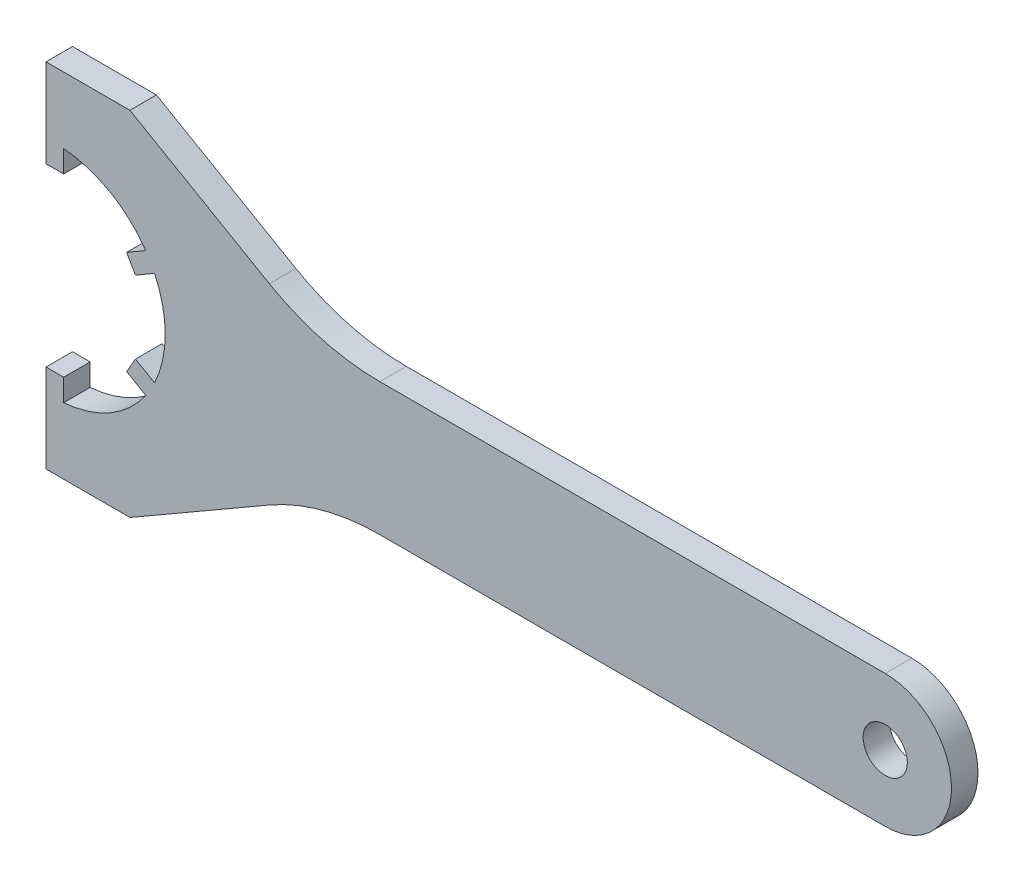
ISO-10303-21;
HEADER;
FILE_DESCRIPTION(('STEP AP214'),'2;1');
FILE_NAME('part.step','',(''),(''),'','','');
FILE_SCHEMA(('AUTOMOTIVE_DESIGN { 1 0 10303 214 1 1 1 1 }'));
ENDSEC;
DATA;
#1=APPLICATION_CONTEXT('core data for automotive mechanical design processes');
#2=APPLICATION_PROTOCOL_DEFINITION('international standard','automotive_design',2000,#1);
#3=PRODUCT_CONTEXT('',#1,'mechanical');
#4=PRODUCT('Part','Part','',(#3));
#5=PRODUCT_RELATED_PRODUCT_CATEGORY('part','',(#4));
#6=PRODUCT_DEFINITION_FORMATION('','',#4);
#7=PRODUCT_DEFINITION_CONTEXT('part definition',#1,'design');
#8=PRODUCT_DEFINITION('design','',#6,#7);
#9=PRODUCT_DEFINITION_SHAPE('','',#8);
#10=(LENGTH_UNIT() NAMED_UNIT(*) SI_UNIT(.MILLI.,.METRE.));
#11=(NAMED_UNIT(*) PLANE_ANGLE_UNIT() SI_UNIT($,.RADIAN.));
#12=(NAMED_UNIT(*) SI_UNIT($,.STERADIAN.) SOLID_ANGLE_UNIT());
#13=UNCERTAINTY_MEASURE_WITH_UNIT(LENGTH_MEASURE(1.E-05),#10,'distance_accuracy_value','');
#14=(GEOMETRIC_REPRESENTATION_CONTEXT(3) GLOBAL_UNCERTAINTY_ASSIGNED_CONTEXT((#13)) GLOBAL_UNIT_ASSIGNED_CONTEXT((#10,
#11,#12)) REPRESENTATION_CONTEXT('',''));
#15=CARTESIAN_POINT('',(0.,0.,0.));
#16=DIRECTION('',(0.,0.,1.));
#17=DIRECTION('',(1.,0.,0.));
#18=AXIS2_PLACEMENT_3D('',#15,#16,#17);
#19=CARTESIAN_POINT('',(188.,0.,3.));
#20=DIRECTION('',(0.,0.,-1.));
#21=DIRECTION('',(-1.,0.,0.));
#22=AXIS2_PLACEMENT_3D('',#19,#20,#21);
#23=PLANE('',#22);
#24=CARTESIAN_POINT('',(188.,0.,3.));
#25=DIRECTION('',(0.,0.,1.));
#26=DIRECTION('',(-1.,0.,0.));
#27=AXIS2_PLACEMENT_3D('',#24,#25,#26);
#28=CIRCLE('',#27,14.9999999999999);
#29=CARTESIAN_POINT('',(188.,-14.9999999999998,3.));
#30=VERTEX_POINT('',#29);
#31=CARTESIAN_POINT('',(188.,15.,3.));
#32=VERTEX_POINT('',#31);
#33=EDGE_CURVE('E211',#30,#32,#28,.T.);
#34=ORIENTED_EDGE('',*,*,#33,.T.);
#35=DIRECTION('',(-1.,0.,0.));
#36=VECTOR('',#35,1.);
#37=CARTESIAN_POINT('',(60.1624837098144,15.,3.));
#38=LINE('',#37,#36);
#39=CARTESIAN_POINT('',(73.5599433313705,15.,3.));
#40=VERTEX_POINT('',#39);
#41=EDGE_CURVE('E201',#32,#40,#38,.T.);
#42=ORIENTED_EDGE('',*,*,#41,.T.);
#43=CARTESIAN_POINT('',(73.5599433313705,65.,3.));
#44=DIRECTION('',(0.,0.,-1.));
#45=DIRECTION('',(-1.,0.,0.));
#46=AXIS2_PLACEMENT_3D('',#43,#44,#45);
#47=CIRCLE('',#46,50.);
#48=CARTESIAN_POINT('',(48.5599433313705,21.6987298107781,3.));
#49=VERTEX_POINT('',#48);
#50=EDGE_CURVE('E11',#40,#49,#47,.T.);
#51=ORIENTED_EDGE('',*,*,#50,.T.);
#52=DIRECTION('',(-0.866025403784438,0.500000000000001,0.));
#53=VECTOR('',#52,1.);
#54=CARTESIAN_POINT('',(17.,39.9198715887542,3.));
#55=LINE('',#54,#53);
#56=CARTESIAN_POINT('',(17.,39.9198715887542,3.));
#57=VERTEX_POINT('',#56);
#58=EDGE_CURVE('E210',#49,#57,#55,.T.);
#59=ORIENTED_EDGE('',*,*,#58,.T.);
#60=DIRECTION('',(-1.,0.,0.));
#61=VECTOR('',#60,1.);
#62=CARTESIAN_POINT('',(-2.,39.9198715887542,3.));
#63=LINE('',#62,#61);
#64=CARTESIAN_POINT('',(-2.,39.9198715887542,3.));
#65=VERTEX_POINT('',#64);
#66=EDGE_CURVE('E365',#57,#65,#63,.T.);
#67=ORIENTED_EDGE('',*,*,#66,.T.);
#68=DIRECTION('',(0.,-1.,0.));
#69=VECTOR('',#68,1.);
#70=CARTESIAN_POINT('',(-2.,24.9198715887542,3.));
#71=LINE('',#70,#69);
#72=CARTESIAN_POINT('',(-2.,19.9198715887542,3.));
#73=VERTEX_POINT('',#72);
#74=EDGE_CURVE('E360',#65,#73,#71,.T.);
#75=ORIENTED_EDGE('',*,*,#74,.T.);
#76=DIRECTION('',(1.,0.,0.));
#77=VECTOR('',#76,1.);
#78=CARTESIAN_POINT('',(2.,19.9198715887542,3.));
#79=LINE('',#78,#77);
#80=CARTESIAN_POINT('',(2.,19.9198715887542,3.));
#81=VERTEX_POINT('',#80);
#82=EDGE_CURVE('E454',#73,#81,#79,.T.);
#83=ORIENTED_EDGE('',*,*,#82,.T.);
#84=DIRECTION('',(0.,1.,0.));
#85=VECTOR('',#84,1.);
#86=CARTESIAN_POINT('',(2.,24.9198715887542,3.));
#87=LINE('',#86,#85);
#88=CARTESIAN_POINT('',(2.,24.9198715887542,3.));
#89=VERTEX_POINT('',#88);
#90=EDGE_CURVE('E457',#81,#89,#87,.T.);
#91=ORIENTED_EDGE('',*,*,#90,.T.);
#92=CARTESIAN_POINT('',(0.,0.,3.));
#93=DIRECTION('',(0.,0.,-1.));
#94=DIRECTION('',(1.,0.,0.));
#95=AXIS2_PLACEMENT_3D('',#92,#93,#94);
#96=CIRCLE('',#95,25.);
#97=CARTESIAN_POINT('',(20.5812418549073,14.1919866019459,3.));
#98=VERTEX_POINT('',#97);
#99=EDGE_CURVE('E460',#89,#98,#96,.T.);
#100=ORIENTED_EDGE('',*,*,#99,.T.);
#101=DIRECTION('',(-0.86602540378444,-0.499999999999998,0.));
#102=VECTOR('',#101,1.);
#103=CARTESIAN_POINT('',(16.2511148359851,11.691986601946,3.));
#104=LINE('',#103,#102);
#105=CARTESIAN_POINT('',(16.2511148359851,11.691986601946,3.));
#106=VERTEX_POINT('',#105);
#107=EDGE_CURVE('E463',#98,#106,#104,.T.);
#108=ORIENTED_EDGE('',*,*,#107,.T.);
#109=DIRECTION('',(0.499999999999998,-0.86602540378444,0.));
#110=VECTOR('',#109,1.);
#111=CARTESIAN_POINT('',(18.2511148359851,8.22788498680819,3.));
#112=LINE('',#111,#110);
#113=CARTESIAN_POINT('',(18.2511148359851,8.22788498680819,3.));
#114=VERTEX_POINT('',#113);
#115=EDGE_CURVE('E466',#106,#114,#112,.T.);
#116=ORIENTED_EDGE('',*,*,#115,.T.);
#117=DIRECTION('',(0.86602540378444,0.499999999999998,0.));
#118=VECTOR('',#117,1.);
#119=CARTESIAN_POINT('',(22.5812418549073,10.7278849868082,3.));
#120=LINE('',#119,#118);
#121=CARTESIAN_POINT('',(22.5812418549072,10.7278849868082,3.));
#122=VERTEX_POINT('',#121);
#123=EDGE_CURVE('E469',#114,#122,#120,.T.);
#124=ORIENTED_EDGE('',*,*,#123,.T.);
#125=CARTESIAN_POINT('',(0.,0.,3.));
#126=DIRECTION('',(0.,0.,-1.));
#127=DIRECTION('',(1.,0.,0.));
#128=AXIS2_PLACEMENT_3D('',#125,#126,#127);
#129=CIRCLE('',#128,25.);
#130=CARTESIAN_POINT('',(22.5812418549072,-10.7278849868081,3.));
#131=VERTEX_POINT('',#130);
#132=EDGE_CURVE('E472',#122,#131,#129,.T.);
#133=ORIENTED_EDGE('',*,*,#132,.T.);
#134=DIRECTION('',(-0.866025403784438,0.500000000000001,0.));
#135=VECTOR('',#134,1.);
#136=CARTESIAN_POINT('',(18.251114835985,-8.22788498680813,3.));
#137=LINE('',#136,#135);
#138=CARTESIAN_POINT('',(18.251114835985,-8.22788498680813,3.));
#139=VERTEX_POINT('',#138);
#140=EDGE_CURVE('E475',#131,#139,#137,.T.);
#141=ORIENTED_EDGE('',*,*,#140,.T.);
#142=DIRECTION('',(-0.5,-0.866025403784439,0.));
#143=VECTOR('',#142,1.);
#144=CARTESIAN_POINT('',(16.251114835985,-11.6919866019459,3.));
#145=LINE('',#144,#143);
#146=CARTESIAN_POINT('',(16.251114835985,-11.6919866019459,3.));
#147=VERTEX_POINT('',#146);
#148=EDGE_CURVE('E478',#139,#147,#145,.T.);
#149=ORIENTED_EDGE('',*,*,#148,.T.);
#150=DIRECTION('',(0.866025403784437,-0.500000000000002,0.));
#151=VECTOR('',#150,1.);
#152=CARTESIAN_POINT('',(20.5812418549072,-14.1919866019459,3.));
#153=LINE('',#152,#151);
#154=CARTESIAN_POINT('',(20.5812418549072,-14.1919866019459,3.));
#155=VERTEX_POINT('',#154);
#156=EDGE_CURVE('E481',#147,#155,#153,.T.);
#157=ORIENTED_EDGE('',*,*,#156,.T.);
#158=CARTESIAN_POINT('',(0.,0.,3.));
#159=DIRECTION('',(0.,0.,-1.));
#160=DIRECTION('',(1.,0.,0.));
#161=AXIS2_PLACEMENT_3D('',#158,#159,#160);
#162=CIRCLE('',#161,24.9999999999999);
#163=CARTESIAN_POINT('',(2.00000000000001,-24.9198715887541,3.));
#164=VERTEX_POINT('',#163);
#165=EDGE_CURVE('E484',#155,#164,#162,.T.);
#166=ORIENTED_EDGE('',*,*,#165,.T.);
#167=DIRECTION('',(0.,1.,0.));
#168=VECTOR('',#167,1.);
#169=CARTESIAN_POINT('',(2.00000000000002,-19.9198715887541,3.));
#170=LINE('',#169,#168);
#171=CARTESIAN_POINT('',(2.00000000000002,-19.9198715887541,3.));
#172=VERTEX_POINT('',#171);
#173=EDGE_CURVE('E487',#164,#172,#170,.T.);
#174=ORIENTED_EDGE('',*,*,#173,.T.);
#175=DIRECTION('',(-1.,0.,0.));
#176=VECTOR('',#175,1.);
#177=CARTESIAN_POINT('',(-1.99999999999998,-19.9198715887541,3.));
#178=LINE('',#177,#176);
#179=CARTESIAN_POINT('',(-1.99999999999998,-19.9198715887541,3.));
#180=VERTEX_POINT('',#179);
#181=EDGE_CURVE('E435',#172,#180,#178,.T.);
#182=ORIENTED_EDGE('',*,*,#181,.T.);
#183=DIRECTION('',(0.,-1.,0.));
#184=VECTOR('',#183,1.);
#185=CARTESIAN_POINT('',(-1.99999999999999,-24.9198715887541,3.));
#186=LINE('',#185,#184);
#187=CARTESIAN_POINT('',(-2.,-39.9198715887542,3.));
#188=VERTEX_POINT('',#187);
#189=EDGE_CURVE('E430',#180,#188,#186,.T.);
#190=ORIENTED_EDGE('',*,*,#189,.T.);
#191=DIRECTION('',(1.,0.,0.));
#192=VECTOR('',#191,1.);
#193=CARTESIAN_POINT('',(-2.,-39.9198715887542,3.));
#194=LINE('',#193,#192);
#195=CARTESIAN_POINT('',(17.,-39.9198715887542,3.));
#196=VERTEX_POINT('',#195);
#197=EDGE_CURVE('E428',#188,#196,#194,.T.);
#198=ORIENTED_EDGE('',*,*,#197,.T.);
#199=DIRECTION('',(0.866025403784437,0.500000000000003,0.));
#200=VECTOR('',#199,1.);
#201=CARTESIAN_POINT('',(17.,-39.9198715887542,3.));
#202=LINE('',#201,#200);
#203=CARTESIAN_POINT('',(48.5599433313704,-21.698729810778,3.));
#204=VERTEX_POINT('',#203);
#205=EDGE_CURVE('E257',#196,#204,#202,.T.);
#206=ORIENTED_EDGE('',*,*,#205,.T.);
#207=CARTESIAN_POINT('',(73.5599433313706,-64.9999999999998,3.));
#208=DIRECTION('',(0.,0.,-1.));
#209=DIRECTION('',(-1.,0.,0.));
#210=AXIS2_PLACEMENT_3D('',#207,#208,#209);
#211=CIRCLE('',#210,50.);
#212=CARTESIAN_POINT('',(73.5599433313705,-14.9999999999999,3.));
#213=VERTEX_POINT('',#212);
#214=EDGE_CURVE('E251',#204,#213,#211,.T.);
#215=ORIENTED_EDGE('',*,*,#214,.T.);
#216=DIRECTION('',(1.,0.,0.));
#217=VECTOR('',#216,1.);
#218=CARTESIAN_POINT('',(60.1624837098143,-14.9999999999999,3.));
#219=LINE('',#218,#217);
#220=EDGE_CURVE('E216',#213,#30,#219,.T.);
#221=ORIENTED_EDGE('',*,*,#220,.T.);
#222=EDGE_LOOP('',(#34,#42,#51,#59,#67,#75,#83,#91,#100,#108,#116,#124,#133,#141,#149,#157,#166,
#174,#182,#190,#198,#206,#215,#221));
#223=FACE_BOUND('',#222,.T.);
#224=CARTESIAN_POINT('',(188.,0.,3.));
#225=DIRECTION('',(0.,0.,1.));
#226=DIRECTION('',(1.,0.,0.));
#227=AXIS2_PLACEMENT_3D('',#224,#225,#226);
#228=CIRCLE('',#227,4.99999999999999);
#229=CARTESIAN_POINT('',(193.,0.,3.));
#230=VERTEX_POINT('',#229);
#231=EDGE_CURVE('E440',#230,#230,#228,.T.);
#232=ORIENTED_EDGE('',*,*,#231,.F.);
#233=EDGE_LOOP('',(#232));
#234=FACE_BOUND('',#233,.T.);
#235=ADVANCED_FACE('F43',(#223,#234),#23,.F.);
#236=CARTESIAN_POINT('',(188.,0.,-3.));
#237=DIRECTION('',(0.,0.,-1.));
#238=DIRECTION('',(-1.,0.,0.));
#239=AXIS2_PLACEMENT_3D('',#236,#237,#238);
#240=PLANE('',#239);
#241=CARTESIAN_POINT('',(188.,0.,-3.));
#242=DIRECTION('',(0.,0.,1.));
#243=DIRECTION('',(-1.,0.,0.));
#244=AXIS2_PLACEMENT_3D('',#241,#242,#243);
#245=CIRCLE('',#244,14.9999999999999);
#246=CARTESIAN_POINT('',(188.,-14.9999999999998,-3.));
#247=VERTEX_POINT('',#246);
#248=CARTESIAN_POINT('',(188.,15.,-3.));
#249=VERTEX_POINT('',#248);
#250=EDGE_CURVE('E225',#247,#249,#245,.T.);
#251=ORIENTED_EDGE('',*,*,#250,.F.);
#252=DIRECTION('',(1.,0.,0.));
#253=VECTOR('',#252,1.);
#254=CARTESIAN_POINT('',(60.1624837098143,-14.9999999999999,-3.));
#255=LINE('',#254,#253);
#256=CARTESIAN_POINT('',(73.5599433313705,-14.9999999999999,-3.));
#257=VERTEX_POINT('',#256);
#258=EDGE_CURVE('E221',#257,#247,#255,.T.);
#259=ORIENTED_EDGE('',*,*,#258,.F.);
#260=CARTESIAN_POINT('',(73.5599433313706,-64.9999999999998,-3.));
#261=DIRECTION('',(0.,0.,-1.));
#262=DIRECTION('',(-1.,0.,0.));
#263=AXIS2_PLACEMENT_3D('',#260,#261,#262);
#264=CIRCLE('',#263,50.);
#265=CARTESIAN_POINT('',(48.5599433313704,-21.698729810778,-3.));
#266=VERTEX_POINT('',#265);
#267=EDGE_CURVE('E248',#257,#266,#264,.F.);
#268=ORIENTED_EDGE('',*,*,#267,.T.);
#269=DIRECTION('',(0.866025403784437,0.500000000000003,0.));
#270=VECTOR('',#269,1.);
#271=CARTESIAN_POINT('',(17.,-39.9198715887542,-3.));
#272=LINE('',#271,#270);
#273=CARTESIAN_POINT('',(17.,-39.9198715887542,-3.));
#274=VERTEX_POINT('',#273);
#275=EDGE_CURVE('E273',#274,#266,#272,.T.);
#276=ORIENTED_EDGE('',*,*,#275,.F.);
#277=DIRECTION('',(1.,0.,0.));
#278=VECTOR('',#277,1.);
#279=CARTESIAN_POINT('',(-2.,-39.9198715887542,-3.));
#280=LINE('',#279,#278);
#281=CARTESIAN_POINT('',(-2.,-39.9198715887542,-3.));
#282=VERTEX_POINT('',#281);
#283=EDGE_CURVE('E280',#282,#274,#280,.T.);
#284=ORIENTED_EDGE('',*,*,#283,.F.);
#285=DIRECTION('',(0.,-1.,0.));
#286=VECTOR('',#285,1.);
#287=CARTESIAN_POINT('',(-1.99999999999999,-24.9198715887541,-3.));
#288=LINE('',#287,#286);
#289=CARTESIAN_POINT('',(-1.99999999999998,-19.9198715887541,-3.));
#290=VERTEX_POINT('',#289);
#291=EDGE_CURVE('E285',#290,#282,#288,.T.);
#292=ORIENTED_EDGE('',*,*,#291,.F.);
#293=DIRECTION('',(-1.,0.,0.));
#294=VECTOR('',#293,1.);
#295=CARTESIAN_POINT('',(-1.99999999999998,-19.9198715887541,-3.));
#296=LINE('',#295,#294);
#297=CARTESIAN_POINT('',(2.00000000000002,-19.9198715887541,-3.));
#298=VERTEX_POINT('',#297);
#299=EDGE_CURVE('E415',#298,#290,#296,.T.);
#300=ORIENTED_EDGE('',*,*,#299,.F.);
#301=DIRECTION('',(0.,1.,0.));
#302=VECTOR('',#301,1.);
#303=CARTESIAN_POINT('',(2.00000000000002,-19.9198715887541,-3.));
#304=LINE('',#303,#302);
#305=CARTESIAN_POINT('',(2.00000000000001,-24.9198715887541,-3.));
#306=VERTEX_POINT('',#305);
#307=EDGE_CURVE('E412',#306,#298,#304,.T.);
#308=ORIENTED_EDGE('',*,*,#307,.F.);
#309=CARTESIAN_POINT('',(0.,0.,-3.));
#310=DIRECTION('',(0.,0.,-1.));
#311=DIRECTION('',(1.,0.,0.));
#312=AXIS2_PLACEMENT_3D('',#309,#310,#311);
#313=CIRCLE('',#312,24.9999999999999);
#314=CARTESIAN_POINT('',(20.5812418549072,-14.1919866019459,-3.));
#315=VERTEX_POINT('',#314);
#316=EDGE_CURVE('E409',#315,#306,#313,.T.);
#317=ORIENTED_EDGE('',*,*,#316,.F.);
#318=DIRECTION('',(0.866025403784437,-0.500000000000002,0.));
#319=VECTOR('',#318,1.);
#320=CARTESIAN_POINT('',(20.5812418549072,-14.1919866019459,-3.));
#321=LINE('',#320,#319);
#322=CARTESIAN_POINT('',(16.251114835985,-11.6919866019459,-3.));
#323=VERTEX_POINT('',#322);
#324=EDGE_CURVE('E406',#323,#315,#321,.T.);
#325=ORIENTED_EDGE('',*,*,#324,.F.);
#326=DIRECTION('',(-0.5,-0.866025403784439,0.));
#327=VECTOR('',#326,1.);
#328=CARTESIAN_POINT('',(16.251114835985,-11.6919866019459,-3.));
#329=LINE('',#328,#327);
#330=CARTESIAN_POINT('',(18.251114835985,-8.22788498680813,-3.));
#331=VERTEX_POINT('',#330);
#332=EDGE_CURVE('E403',#331,#323,#329,.T.);
#333=ORIENTED_EDGE('',*,*,#332,.F.);
#334=DIRECTION('',(-0.866025403784438,0.500000000000001,0.));
#335=VECTOR('',#334,1.);
#336=CARTESIAN_POINT('',(18.251114835985,-8.22788498680813,-3.));
#337=LINE('',#336,#335);
#338=CARTESIAN_POINT('',(22.5812418549072,-10.7278849868081,-3.));
#339=VERTEX_POINT('',#338);
#340=EDGE_CURVE('E400',#339,#331,#337,.T.);
#341=ORIENTED_EDGE('',*,*,#340,.F.);
#342=CARTESIAN_POINT('',(0.,0.,-3.));
#343=DIRECTION('',(0.,0.,-1.));
#344=DIRECTION('',(1.,0.,0.));
#345=AXIS2_PLACEMENT_3D('',#342,#343,#344);
#346=CIRCLE('',#345,25.);
#347=CARTESIAN_POINT('',(22.5812418549072,10.7278849868082,-3.));
#348=VERTEX_POINT('',#347);
#349=EDGE_CURVE('E397',#348,#339,#346,.T.);
#350=ORIENTED_EDGE('',*,*,#349,.F.);
#351=DIRECTION('',(0.86602540378444,0.499999999999998,0.));
#352=VECTOR('',#351,1.);
#353=CARTESIAN_POINT('',(22.5812418549073,10.7278849868082,-3.));
#354=LINE('',#353,#352);
#355=CARTESIAN_POINT('',(18.2511148359851,8.22788498680819,-3.));
#356=VERTEX_POINT('',#355);
#357=EDGE_CURVE('E394',#356,#348,#354,.T.);
#358=ORIENTED_EDGE('',*,*,#357,.F.);
#359=DIRECTION('',(0.499999999999998,-0.86602540378444,0.));
#360=VECTOR('',#359,1.);
#361=CARTESIAN_POINT('',(18.2511148359851,8.22788498680819,-3.));
#362=LINE('',#361,#360);
#363=CARTESIAN_POINT('',(16.2511148359851,11.691986601946,-3.));
#364=VERTEX_POINT('',#363);
#365=EDGE_CURVE('E391',#364,#356,#362,.T.);
#366=ORIENTED_EDGE('',*,*,#365,.F.);
#367=DIRECTION('',(-0.86602540378444,-0.499999999999998,0.));
#368=VECTOR('',#367,1.);
#369=CARTESIAN_POINT('',(16.2511148359851,11.691986601946,-3.));
#370=LINE('',#369,#368);
#371=CARTESIAN_POINT('',(20.5812418549073,14.1919866019459,-3.));
#372=VERTEX_POINT('',#371);
#373=EDGE_CURVE('E388',#372,#364,#370,.T.);
#374=ORIENTED_EDGE('',*,*,#373,.F.);
#375=CARTESIAN_POINT('',(0.,0.,-3.));
#376=DIRECTION('',(0.,0.,-1.));
#377=DIRECTION('',(1.,0.,0.));
#378=AXIS2_PLACEMENT_3D('',#375,#376,#377);
#379=CIRCLE('',#378,25.);
#380=CARTESIAN_POINT('',(2.,24.9198715887542,-3.));
#381=VERTEX_POINT('',#380);
#382=EDGE_CURVE('E385',#381,#372,#379,.T.);
#383=ORIENTED_EDGE('',*,*,#382,.F.);
#384=DIRECTION('',(0.,1.,0.));
#385=VECTOR('',#384,1.);
#386=CARTESIAN_POINT('',(2.,24.9198715887542,-3.));
#387=LINE('',#386,#385);
#388=CARTESIAN_POINT('',(2.,19.9198715887542,-3.));
#389=VERTEX_POINT('',#388);
#390=EDGE_CURVE('E382',#389,#381,#387,.T.);
#391=ORIENTED_EDGE('',*,*,#390,.F.);
#392=DIRECTION('',(1.,0.,0.));
#393=VECTOR('',#392,1.);
#394=CARTESIAN_POINT('',(2.,19.9198715887542,-3.));
#395=LINE('',#394,#393);
#396=CARTESIAN_POINT('',(-2.,19.9198715887542,-3.));
#397=VERTEX_POINT('',#396);
#398=EDGE_CURVE('E374',#397,#389,#395,.T.);
#399=ORIENTED_EDGE('',*,*,#398,.F.);
#400=DIRECTION('',(0.,-1.,0.));
#401=VECTOR('',#400,1.);
#402=CARTESIAN_POINT('',(-2.,19.9198715887542,-3.));
#403=LINE('',#402,#401);
#404=CARTESIAN_POINT('',(-2.,39.9198715887542,-3.));
#405=VERTEX_POINT('',#404);
#406=EDGE_CURVE('E359',#405,#397,#403,.T.);
#407=ORIENTED_EDGE('',*,*,#406,.F.);
#408=DIRECTION('',(-1.,0.,0.));
#409=VECTOR('',#408,1.);
#410=CARTESIAN_POINT('',(-2.,39.9198715887542,-3.));
#411=LINE('',#410,#409);
#412=CARTESIAN_POINT('',(17.,39.9198715887542,-3.));
#413=VERTEX_POINT('',#412);
#414=EDGE_CURVE('E367',#413,#405,#411,.T.);
#415=ORIENTED_EDGE('',*,*,#414,.F.);
#416=DIRECTION('',(-0.866025403784438,0.500000000000001,0.));
#417=VECTOR('',#416,1.);
#418=CARTESIAN_POINT('',(17.,39.9198715887542,-3.));
#419=LINE('',#418,#417);
#420=CARTESIAN_POINT('',(48.5599433313705,21.6987298107781,-3.));
#421=VERTEX_POINT('',#420);
#422=EDGE_CURVE('E370',#421,#413,#419,.T.);
#423=ORIENTED_EDGE('',*,*,#422,.F.);
#424=CARTESIAN_POINT('',(73.5599433313705,65.,-3.));
#425=DIRECTION('',(0.,0.,-1.));
#426=DIRECTION('',(-1.,0.,0.));
#427=AXIS2_PLACEMENT_3D('',#424,#425,#426);
#428=CIRCLE('',#427,50.);
#429=CARTESIAN_POINT('',(73.5599433313705,15.,-3.));
#430=VERTEX_POINT('',#429);
#431=EDGE_CURVE('E52',#421,#430,#428,.F.);
#432=ORIENTED_EDGE('',*,*,#431,.T.);
#433=DIRECTION('',(-1.,0.,0.));
#434=VECTOR('',#433,1.);
#435=CARTESIAN_POINT('',(60.1624837098144,15.,-3.));
#436=LINE('',#435,#434);
#437=EDGE_CURVE('E376',#249,#430,#436,.T.);
#438=ORIENTED_EDGE('',*,*,#437,.F.);
#439=EDGE_LOOP('',(#251,#259,#268,#276,#284,#292,#300,#308,#317,#325,#333,#341,#350,#358,#366,
#374,#383,#391,#399,#407,#415,#423,#432,#438));
#440=FACE_BOUND('',#439,.T.);
#441=CARTESIAN_POINT('',(188.,0.,-3.));
#442=DIRECTION('',(0.,0.,1.));
#443=DIRECTION('',(1.,0.,0.));
#444=AXIS2_PLACEMENT_3D('',#441,#442,#443);
#445=CIRCLE('',#444,4.99999999999999);
#446=CARTESIAN_POINT('',(193.,0.,-3.));
#447=VERTEX_POINT('',#446);
#448=EDGE_CURVE('E834',#447,#447,#445,.T.);
#449=ORIENTED_EDGE('',*,*,#448,.T.);
#450=EDGE_LOOP('',(#449));
#451=FACE_BOUND('',#450,.T.);
#452=ADVANCED_FACE('F270',(#440,#451),#240,.T.);
#453=CARTESIAN_POINT('',(188.,0.,3.));
#454=DIRECTION('',(0.,0.,-1.));
#455=DIRECTION('',(-1.,0.,0.));
#456=AXIS2_PLACEMENT_3D('',#453,#454,#455);
#457=CYLINDRICAL_SURFACE('',#456,14.9999999999999);
#458=ORIENTED_EDGE('',*,*,#250,.T.);
#459=DIRECTION('',(0.,0.,-1.));
#460=VECTOR('',#459,1.);
#461=CARTESIAN_POINT('',(188.,15.,3.));
#462=LINE('',#461,#460);
#463=EDGE_CURVE('E205',#32,#249,#462,.T.);
#464=ORIENTED_EDGE('',*,*,#463,.F.);
#465=ORIENTED_EDGE('',*,*,#33,.F.);
#466=DIRECTION('',(0.,0.,-1.));
#467=VECTOR('',#466,1.);
#468=CARTESIAN_POINT('',(188.,-14.9999999999998,3.));
#469=LINE('',#468,#467);
#470=EDGE_CURVE('E264',#30,#247,#469,.T.);
#471=ORIENTED_EDGE('',*,*,#470,.T.);
#472=EDGE_LOOP('',(#458,#464,#465,#471));
#473=FACE_BOUND('',#472,.T.);
#474=ADVANCED_FACE('F223',(#473),#457,.T.);
#475=CARTESIAN_POINT('',(60.1624837098144,15.,3.));
#476=DIRECTION('',(0.,-1.,0.));
#477=DIRECTION('',(1.,0.,0.));
#478=AXIS2_PLACEMENT_3D('',#475,#476,#477);
#479=PLANE('',#478);
#480=ORIENTED_EDGE('',*,*,#437,.T.);
#481=DIRECTION('',(0.,0.,-1.));
#482=VECTOR('',#481,1.);
#483=CARTESIAN_POINT('',(73.5599433313705,15.,3.));
#484=LINE('',#483,#482);
#485=EDGE_CURVE('E59',#430,#40,#484,.F.);
#486=ORIENTED_EDGE('',*,*,#485,.T.);
#487=ORIENTED_EDGE('',*,*,#41,.F.);
#488=ORIENTED_EDGE('',*,*,#463,.T.);
#489=EDGE_LOOP('',(#480,#486,#487,#488));
#490=FACE_BOUND('',#489,.T.);
#491=ADVANCED_FACE('F203',(#490),#479,.F.);
#492=CARTESIAN_POINT('',(17.,39.9198715887542,3.));
#493=DIRECTION('',(-0.500000000000001,-0.866025403784438,0.));
#494=DIRECTION('',(0.866025403784438,-0.500000000000001,0.));
#495=AXIS2_PLACEMENT_3D('',#492,#493,#494);
#496=PLANE('',#495);
#497=ORIENTED_EDGE('',*,*,#58,.F.);
#498=DIRECTION('',(0.,0.,-1.));
#499=VECTOR('',#498,1.);
#500=CARTESIAN_POINT('',(48.5599433313705,21.6987298107781,-3.));
#501=LINE('',#500,#499);
#502=EDGE_CURVE('E242',#49,#421,#501,.T.);
#503=ORIENTED_EDGE('',*,*,#502,.T.);
#504=ORIENTED_EDGE('',*,*,#422,.T.);
#505=DIRECTION('',(0.,0.,-1.));
#506=VECTOR('',#505,1.);
#507=CARTESIAN_POINT('',(17.,39.9198715887542,3.));
#508=LINE('',#507,#506);
#509=EDGE_CURVE('E228',#57,#413,#508,.T.);
#510=ORIENTED_EDGE('',*,*,#509,.F.);
#511=EDGE_LOOP('',(#497,#503,#504,#510));
#512=FACE_BOUND('',#511,.T.);
#513=ADVANCED_FACE('F446',(#512),#496,.F.);
#514=CARTESIAN_POINT('',(-2.,39.9198715887542,3.));
#515=DIRECTION('',(0.,-1.,0.));
#516=DIRECTION('',(0.,0.,-1.));
#517=AXIS2_PLACEMENT_3D('',#514,#515,#516);
#518=PLANE('',#517);
#519=ORIENTED_EDGE('',*,*,#414,.T.);
#520=DIRECTION('',(0.,0.,-1.));
#521=VECTOR('',#520,1.);
#522=CARTESIAN_POINT('',(-2.,39.9198715887542,3.));
#523=LINE('',#522,#521);
#524=EDGE_CURVE('E236',#65,#405,#523,.T.);
#525=ORIENTED_EDGE('',*,*,#524,.F.);
#526=ORIENTED_EDGE('',*,*,#66,.F.);
#527=ORIENTED_EDGE('',*,*,#509,.T.);
#528=EDGE_LOOP('',(#519,#525,#526,#527));
#529=FACE_BOUND('',#528,.T.);
#530=ADVANCED_FACE('F364',(#529),#518,.F.);
#531=CARTESIAN_POINT('',(-2.,19.9198715887542,3.));
#532=DIRECTION('',(1.,0.,0.));
#533=DIRECTION('',(0.,0.,-1.));
#534=AXIS2_PLACEMENT_3D('',#531,#532,#533);
#535=PLANE('',#534);
#536=ORIENTED_EDGE('',*,*,#406,.T.);
#537=DIRECTION('',(0.,0.,-1.));
#538=VECTOR('',#537,1.);
#539=CARTESIAN_POINT('',(-2.,19.9198715887542,3.));
#540=LINE('',#539,#538);
#541=EDGE_CURVE('E349',#73,#397,#540,.T.);
#542=ORIENTED_EDGE('',*,*,#541,.F.);
#543=ORIENTED_EDGE('',*,*,#74,.F.);
#544=ORIENTED_EDGE('',*,*,#524,.T.);
#545=EDGE_LOOP('',(#536,#542,#543,#544));
#546=FACE_BOUND('',#545,.T.);
#547=ADVANCED_FACE('F357',(#546),#535,.F.);
#548=CARTESIAN_POINT('',(2.,19.9198715887542,3.));
#549=DIRECTION('',(0.,1.,0.));
#550=DIRECTION('',(0.,0.,1.));
#551=AXIS2_PLACEMENT_3D('',#548,#549,#550);
#552=PLANE('',#551);
#553=ORIENTED_EDGE('',*,*,#398,.T.);
#554=DIRECTION('',(0.,0.,-1.));
#555=VECTOR('',#554,1.);
#556=CARTESIAN_POINT('',(2.,19.9198715887542,3.));
#557=LINE('',#556,#555);
#558=EDGE_CURVE('E345',#81,#389,#557,.T.);
#559=ORIENTED_EDGE('',*,*,#558,.F.);
#560=ORIENTED_EDGE('',*,*,#82,.F.);
#561=ORIENTED_EDGE('',*,*,#541,.T.);
#562=EDGE_LOOP('',(#553,#559,#560,#561));
#563=FACE_BOUND('',#562,.T.);
#564=ADVANCED_FACE('F552',(#563),#552,.F.);
#565=CARTESIAN_POINT('',(2.,24.9198715887542,3.));
#566=DIRECTION('',(-1.,0.,0.));
#567=DIRECTION('',(0.,0.,1.));
#568=AXIS2_PLACEMENT_3D('',#565,#566,#567);
#569=PLANE('',#568);
#570=ORIENTED_EDGE('',*,*,#390,.T.);
#571=DIRECTION('',(0.,0.,-1.));
#572=VECTOR('',#571,1.);
#573=CARTESIAN_POINT('',(2.,24.9198715887542,3.));
#574=LINE('',#573,#572);
#575=EDGE_CURVE('E341',#89,#381,#574,.T.);
#576=ORIENTED_EDGE('',*,*,#575,.F.);
#577=ORIENTED_EDGE('',*,*,#90,.F.);
#578=ORIENTED_EDGE('',*,*,#558,.T.);
#579=EDGE_LOOP('',(#570,#576,#577,#578));
#580=FACE_BOUND('',#579,.T.);
#581=ADVANCED_FACE('F548',(#580),#569,.F.);
#582=CARTESIAN_POINT('',(0.,0.,3.));
#583=DIRECTION('',(0.,0.,-1.));
#584=DIRECTION('',(-1.,0.,0.));
#585=AXIS2_PLACEMENT_3D('',#582,#583,#584);
#586=CYLINDRICAL_SURFACE('',#585,25.);
#587=ORIENTED_EDGE('',*,*,#382,.T.);
#588=DIRECTION('',(0.,0.,-1.));
#589=VECTOR('',#588,1.);
#590=CARTESIAN_POINT('',(20.5812418549073,14.1919866019459,3.));
#591=LINE('',#590,#589);
#592=EDGE_CURVE('E337',#98,#372,#591,.T.);
#593=ORIENTED_EDGE('',*,*,#592,.F.);
#594=ORIENTED_EDGE('',*,*,#99,.F.);
#595=ORIENTED_EDGE('',*,*,#575,.T.);
#596=EDGE_LOOP('',(#587,#593,#594,#595));
#597=FACE_BOUND('',#596,.T.);
#598=ADVANCED_FACE('F543',(#597),#586,.F.);
#599=CARTESIAN_POINT('',(16.2511148359851,11.691986601946,3.));
#600=DIRECTION('',(0.499999999999998,-0.86602540378444,0.));
#601=DIRECTION('',(0.86602540378444,0.499999999999998,0.));
#602=AXIS2_PLACEMENT_3D('',#599,#600,#601);
#603=PLANE('',#602);
#604=ORIENTED_EDGE('',*,*,#373,.T.);
#605=DIRECTION('',(0.,0.,-1.));
#606=VECTOR('',#605,1.);
#607=CARTESIAN_POINT('',(16.2511148359851,11.691986601946,3.));
#608=LINE('',#607,#606);
#609=EDGE_CURVE('E333',#106,#364,#608,.T.);
#610=ORIENTED_EDGE('',*,*,#609,.F.);
#611=ORIENTED_EDGE('',*,*,#107,.F.);
#612=ORIENTED_EDGE('',*,*,#592,.T.);
#613=EDGE_LOOP('',(#604,#610,#611,#612));
#614=FACE_BOUND('',#613,.T.);
#615=ADVANCED_FACE('F537',(#614),#603,.F.);
#616=CARTESIAN_POINT('',(18.2511148359851,8.22788498680819,3.));
#617=DIRECTION('',(0.86602540378444,0.499999999999998,0.));
#618=DIRECTION('',(-0.499999999999998,0.86602540378444,0.));
#619=AXIS2_PLACEMENT_3D('',#616,#617,#618);
#620=PLANE('',#619);
#621=ORIENTED_EDGE('',*,*,#365,.T.);
#622=DIRECTION('',(0.,0.,-1.));
#623=VECTOR('',#622,1.);
#624=CARTESIAN_POINT('',(18.2511148359851,8.22788498680819,3.));
#625=LINE('',#624,#623);
#626=EDGE_CURVE('E329',#114,#356,#625,.T.);
#627=ORIENTED_EDGE('',*,*,#626,.F.);
#628=ORIENTED_EDGE('',*,*,#115,.F.);
#629=ORIENTED_EDGE('',*,*,#609,.T.);
#630=EDGE_LOOP('',(#621,#627,#628,#629));
#631=FACE_BOUND('',#630,.T.);
#632=ADVANCED_FACE('F533',(#631),#620,.F.);
#633=CARTESIAN_POINT('',(22.5812418549073,10.7278849868082,3.));
#634=DIRECTION('',(-0.499999999999998,0.86602540378444,0.));
#635=DIRECTION('',(-0.86602540378444,-0.499999999999998,0.));
#636=AXIS2_PLACEMENT_3D('',#633,#634,#635);
#637=PLANE('',#636);
#638=ORIENTED_EDGE('',*,*,#357,.T.);
#639=DIRECTION('',(0.,0.,-1.));
#640=VECTOR('',#639,1.);
#641=CARTESIAN_POINT('',(22.5812418549072,10.7278849868082,3.));
#642=LINE('',#641,#640);
#643=EDGE_CURVE('E325',#122,#348,#642,.T.);
#644=ORIENTED_EDGE('',*,*,#643,.F.);
#645=ORIENTED_EDGE('',*,*,#123,.F.);
#646=ORIENTED_EDGE('',*,*,#626,.T.);
#647=EDGE_LOOP('',(#638,#644,#645,#646));
#648=FACE_BOUND('',#647,.T.);
#649=ADVANCED_FACE('F528',(#648),#637,.F.);
#650=CARTESIAN_POINT('',(0.,0.,3.));
#651=DIRECTION('',(0.,0.,-1.));
#652=DIRECTION('',(-1.,0.,0.));
#653=AXIS2_PLACEMENT_3D('',#650,#651,#652);
#654=CYLINDRICAL_SURFACE('',#653,25.);
#655=ORIENTED_EDGE('',*,*,#349,.T.);
#656=DIRECTION('',(0.,0.,-1.));
#657=VECTOR('',#656,1.);
#658=CARTESIAN_POINT('',(22.5812418549072,-10.7278849868081,3.));
#659=LINE('',#658,#657);
#660=EDGE_CURVE('E321',#131,#339,#659,.T.);
#661=ORIENTED_EDGE('',*,*,#660,.F.);
#662=ORIENTED_EDGE('',*,*,#132,.F.);
#663=ORIENTED_EDGE('',*,*,#643,.T.);
#664=EDGE_LOOP('',(#655,#661,#662,#663));
#665=FACE_BOUND('',#664,.T.);
#666=ADVANCED_FACE('F522',(#665),#654,.F.);
#667=CARTESIAN_POINT('',(18.251114835985,-8.22788498680813,3.));
#668=DIRECTION('',(-0.500000000000001,-0.866025403784438,0.));
#669=DIRECTION('',(0.866025403784438,-0.500000000000001,0.));
#670=AXIS2_PLACEMENT_3D('',#667,#668,#669);
#671=PLANE('',#670);
#672=ORIENTED_EDGE('',*,*,#340,.T.);
#673=DIRECTION('',(0.,0.,-1.));
#674=VECTOR('',#673,1.);
#675=CARTESIAN_POINT('',(18.251114835985,-8.22788498680813,3.));
#676=LINE('',#675,#674);
#677=EDGE_CURVE('E317',#139,#331,#676,.T.);
#678=ORIENTED_EDGE('',*,*,#677,.F.);
#679=ORIENTED_EDGE('',*,*,#140,.F.);
#680=ORIENTED_EDGE('',*,*,#660,.T.);
#681=EDGE_LOOP('',(#672,#678,#679,#680));
#682=FACE_BOUND('',#681,.T.);
#683=ADVANCED_FACE('F518',(#682),#671,.F.);
#684=CARTESIAN_POINT('',(16.251114835985,-11.6919866019459,3.));
#685=DIRECTION('',(0.866025403784439,-0.5,0.));
#686=DIRECTION('',(0.5,0.866025403784439,0.));
#687=AXIS2_PLACEMENT_3D('',#684,#685,#686);
#688=PLANE('',#687);
#689=ORIENTED_EDGE('',*,*,#332,.T.);
#690=DIRECTION('',(0.,0.,-1.));
#691=VECTOR('',#690,1.);
#692=CARTESIAN_POINT('',(16.251114835985,-11.6919866019459,3.));
#693=LINE('',#692,#691);
#694=EDGE_CURVE('E313',#147,#323,#693,.T.);
#695=ORIENTED_EDGE('',*,*,#694,.F.);
#696=ORIENTED_EDGE('',*,*,#148,.F.);
#697=ORIENTED_EDGE('',*,*,#677,.T.);
#698=EDGE_LOOP('',(#689,#695,#696,#697));
#699=FACE_BOUND('',#698,.T.);
#700=ADVANCED_FACE('F513',(#699),#688,.F.);
#701=CARTESIAN_POINT('',(20.5812418549072,-14.1919866019459,3.));
#702=DIRECTION('',(0.500000000000002,0.866025403784437,0.));
#703=DIRECTION('',(-0.866025403784437,0.500000000000002,0.));
#704=AXIS2_PLACEMENT_3D('',#701,#702,#703);
#705=PLANE('',#704);
#706=ORIENTED_EDGE('',*,*,#324,.T.);
#707=DIRECTION('',(0.,0.,-1.));
#708=VECTOR('',#707,1.);
#709=CARTESIAN_POINT('',(20.5812418549072,-14.1919866019459,3.));
#710=LINE('',#709,#708);
#711=EDGE_CURVE('E309',#155,#315,#710,.T.);
#712=ORIENTED_EDGE('',*,*,#711,.F.);
#713=ORIENTED_EDGE('',*,*,#156,.F.);
#714=ORIENTED_EDGE('',*,*,#694,.T.);
#715=EDGE_LOOP('',(#706,#712,#713,#714));
#716=FACE_BOUND('',#715,.T.);
#717=ADVANCED_FACE('F507',(#716),#705,.F.);
#718=CARTESIAN_POINT('',(0.,0.,3.));
#719=DIRECTION('',(0.,0.,-1.));
#720=DIRECTION('',(-1.,0.,0.));
#721=AXIS2_PLACEMENT_3D('',#718,#719,#720);
#722=CYLINDRICAL_SURFACE('',#721,24.9999999999999);
#723=ORIENTED_EDGE('',*,*,#316,.T.);
#724=DIRECTION('',(0.,0.,-1.));
#725=VECTOR('',#724,1.);
#726=CARTESIAN_POINT('',(2.00000000000001,-24.9198715887541,3.));
#727=LINE('',#726,#725);
#728=EDGE_CURVE('E305',#164,#306,#727,.T.);
#729=ORIENTED_EDGE('',*,*,#728,.F.);
#730=ORIENTED_EDGE('',*,*,#165,.F.);
#731=ORIENTED_EDGE('',*,*,#711,.T.);
#732=EDGE_LOOP('',(#723,#729,#730,#731));
#733=FACE_BOUND('',#732,.T.);
#734=ADVANCED_FACE('F503',(#733),#722,.F.);
#735=CARTESIAN_POINT('',(2.00000000000002,-19.9198715887541,3.));
#736=DIRECTION('',(-1.,0.,0.));
#737=DIRECTION('',(0.,-1.,0.));
#738=AXIS2_PLACEMENT_3D('',#735,#736,#737);
#739=PLANE('',#738);
#740=ORIENTED_EDGE('',*,*,#307,.T.);
#741=DIRECTION('',(0.,0.,-1.));
#742=VECTOR('',#741,1.);
#743=CARTESIAN_POINT('',(2.00000000000002,-19.9198715887541,3.));
#744=LINE('',#743,#742);
#745=EDGE_CURVE('E301',#172,#298,#744,.T.);
#746=ORIENTED_EDGE('',*,*,#745,.F.);
#747=ORIENTED_EDGE('',*,*,#173,.F.);
#748=ORIENTED_EDGE('',*,*,#728,.T.);
#749=EDGE_LOOP('',(#740,#746,#747,#748));
#750=FACE_BOUND('',#749,.T.);
#751=ADVANCED_FACE('F499',(#750),#739,.F.);
#752=CARTESIAN_POINT('',(-1.99999999999998,-19.9198715887541,3.));
#753=DIRECTION('',(0.,-1.,0.));
#754=DIRECTION('',(0.,0.,-1.));
#755=AXIS2_PLACEMENT_3D('',#752,#753,#754);
#756=PLANE('',#755);
#757=ORIENTED_EDGE('',*,*,#299,.T.);
#758=DIRECTION('',(0.,0.,-1.));
#759=VECTOR('',#758,1.);
#760=CARTESIAN_POINT('',(-1.99999999999998,-19.9198715887541,3.));
#761=LINE('',#760,#759);
#762=EDGE_CURVE('E297',#180,#290,#761,.T.);
#763=ORIENTED_EDGE('',*,*,#762,.F.);
#764=ORIENTED_EDGE('',*,*,#181,.F.);
#765=ORIENTED_EDGE('',*,*,#745,.T.);
#766=EDGE_LOOP('',(#757,#763,#764,#765));
#767=FACE_BOUND('',#766,.T.);
#768=ADVANCED_FACE('F494',(#767),#756,.F.);
#769=CARTESIAN_POINT('',(-1.99999999999999,-24.9198715887541,3.));
#770=DIRECTION('',(1.,0.,0.));
#771=DIRECTION('',(0.,1.,0.));
#772=AXIS2_PLACEMENT_3D('',#769,#770,#771);
#773=PLANE('',#772);
#774=ORIENTED_EDGE('',*,*,#291,.T.);
#775=DIRECTION('',(0.,0.,-1.));
#776=VECTOR('',#775,1.);
#777=CARTESIAN_POINT('',(-2.,-39.9198715887542,3.));
#778=LINE('',#777,#776);
#779=EDGE_CURVE('E293',#188,#282,#778,.T.);
#780=ORIENTED_EDGE('',*,*,#779,.F.);
#781=ORIENTED_EDGE('',*,*,#189,.F.);
#782=ORIENTED_EDGE('',*,*,#762,.T.);
#783=EDGE_LOOP('',(#774,#780,#781,#782));
#784=FACE_BOUND('',#783,.T.);
#785=ADVANCED_FACE('F421',(#784),#773,.F.);
#786=CARTESIAN_POINT('',(-2.,-39.9198715887542,3.));
#787=DIRECTION('',(0.,1.,0.));
#788=DIRECTION('',(0.,0.,1.));
#789=AXIS2_PLACEMENT_3D('',#786,#787,#788);
#790=PLANE('',#789);
#791=ORIENTED_EDGE('',*,*,#283,.T.);
#792=DIRECTION('',(0.,0.,-1.));
#793=VECTOR('',#792,1.);
#794=CARTESIAN_POINT('',(17.,-39.9198715887542,3.));
#795=LINE('',#794,#793);
#796=EDGE_CURVE('E278',#196,#274,#795,.T.);
#797=ORIENTED_EDGE('',*,*,#796,.F.);
#798=ORIENTED_EDGE('',*,*,#197,.F.);
#799=ORIENTED_EDGE('',*,*,#779,.T.);
#800=EDGE_LOOP('',(#791,#797,#798,#799));
#801=FACE_BOUND('',#800,.T.);
#802=ADVANCED_FACE('F427',(#801),#790,.F.);
#803=CARTESIAN_POINT('',(17.,-39.9198715887542,3.));
#804=DIRECTION('',(-0.500000000000003,0.866025403784437,0.));
#805=DIRECTION('',(-0.866025403784437,-0.500000000000003,0.));
#806=AXIS2_PLACEMENT_3D('',#803,#804,#805);
#807=PLANE('',#806);
#808=ORIENTED_EDGE('',*,*,#275,.T.);
#809=DIRECTION('',(0.,0.,-1.));
#810=VECTOR('',#809,1.);
#811=CARTESIAN_POINT('',(48.5599433313704,-21.698729810778,3.));
#812=LINE('',#811,#810);
#813=EDGE_CURVE('E233',#266,#204,#812,.F.);
#814=ORIENTED_EDGE('',*,*,#813,.T.);
#815=ORIENTED_EDGE('',*,*,#205,.F.);
#816=ORIENTED_EDGE('',*,*,#796,.T.);
#817=EDGE_LOOP('',(#808,#814,#815,#816));
#818=FACE_BOUND('',#817,.T.);
#819=ADVANCED_FACE('F276',(#818),#807,.F.);
#820=CARTESIAN_POINT('',(60.1624837098143,-14.9999999999999,3.));
#821=DIRECTION('',(0.,1.,0.));
#822=DIRECTION('',(-1.,0.,0.));
#823=AXIS2_PLACEMENT_3D('',#820,#821,#822);
#824=PLANE('',#823);
#825=ORIENTED_EDGE('',*,*,#220,.F.);
#826=DIRECTION('',(0.,0.,-1.));
#827=VECTOR('',#826,1.);
#828=CARTESIAN_POINT('',(73.5599433313705,-14.9999999999999,-3.));
#829=LINE('',#828,#827);
#830=EDGE_CURVE('E227',#213,#257,#829,.T.);
#831=ORIENTED_EDGE('',*,*,#830,.T.);
#832=ORIENTED_EDGE('',*,*,#258,.T.);
#833=ORIENTED_EDGE('',*,*,#470,.F.);
#834=EDGE_LOOP('',(#825,#831,#832,#833));
#835=FACE_BOUND('',#834,.T.);
#836=ADVANCED_FACE('F262',(#835),#824,.F.);
#837=CARTESIAN_POINT('',(188.,0.,3.));
#838=DIRECTION('',(0.,0.,-1.));
#839=DIRECTION('',(-1.,0.,0.));
#840=AXIS2_PLACEMENT_3D('',#837,#838,#839);
#841=CYLINDRICAL_SURFACE('',#840,4.99999999999999);
#842=ORIENTED_EDGE('',*,*,#231,.T.);
#843=EDGE_LOOP('',(#842));
#844=FACE_BOUND('',#843,.T.);
#845=ORIENTED_EDGE('',*,*,#448,.F.);
#846=EDGE_LOOP('',(#845));
#847=FACE_BOUND('',#846,.T.);
#848=ADVANCED_FACE('F568',(#844,#847),#841,.F.);
#849=CARTESIAN_POINT('',(73.5599433313706,-64.9999999999998,3.));
#850=DIRECTION('',(0.,0.,1.));
#851=DIRECTION('',(1.,0.,0.));
#852=AXIS2_PLACEMENT_3D('',#849,#850,#851);
#853=CYLINDRICAL_SURFACE('',#852,50.);
#854=ORIENTED_EDGE('',*,*,#214,.F.);
#855=ORIENTED_EDGE('',*,*,#813,.F.);
#856=ORIENTED_EDGE('',*,*,#267,.F.);
#857=ORIENTED_EDGE('',*,*,#830,.F.);
#858=EDGE_LOOP('',(#854,#855,#856,#857));
#859=FACE_BOUND('',#858,.T.);
#860=ADVANCED_FACE('F267',(#859),#853,.F.);
#861=CARTESIAN_POINT('',(73.5599433313705,65.,3.));
#862=DIRECTION('',(0.,0.,1.));
#863=DIRECTION('',(1.,0.,0.));
#864=AXIS2_PLACEMENT_3D('',#861,#862,#863);
#865=CYLINDRICAL_SURFACE('',#864,50.);
#866=ORIENTED_EDGE('',*,*,#50,.F.);
#867=ORIENTED_EDGE('',*,*,#485,.F.);
#868=ORIENTED_EDGE('',*,*,#431,.F.);
#869=ORIENTED_EDGE('',*,*,#502,.F.);
#870=EDGE_LOOP('',(#866,#867,#868,#869));
#871=FACE_BOUND('',#870,.T.);
#872=ADVANCED_FACE('F45',(#871),#865,.F.);
#873=CLOSED_SHELL('',(#235,#452,#474,#491,#513,#530,#547,#564,#581,#598,#615,#632,#649,#666,
#683,#700,#717,#734,#751,#768,#785,#802,#819,#836,#848,#860,#872));
#874=MANIFOLD_SOLID_BREP('B2',#873);
#875=ADVANCED_BREP_SHAPE_REPRESENTATION('',(#18,#874),#14);
#876=SHAPE_DEFINITION_REPRESENTATION(#9,#875);
ENDSEC;
END-ISO-10303-21;
